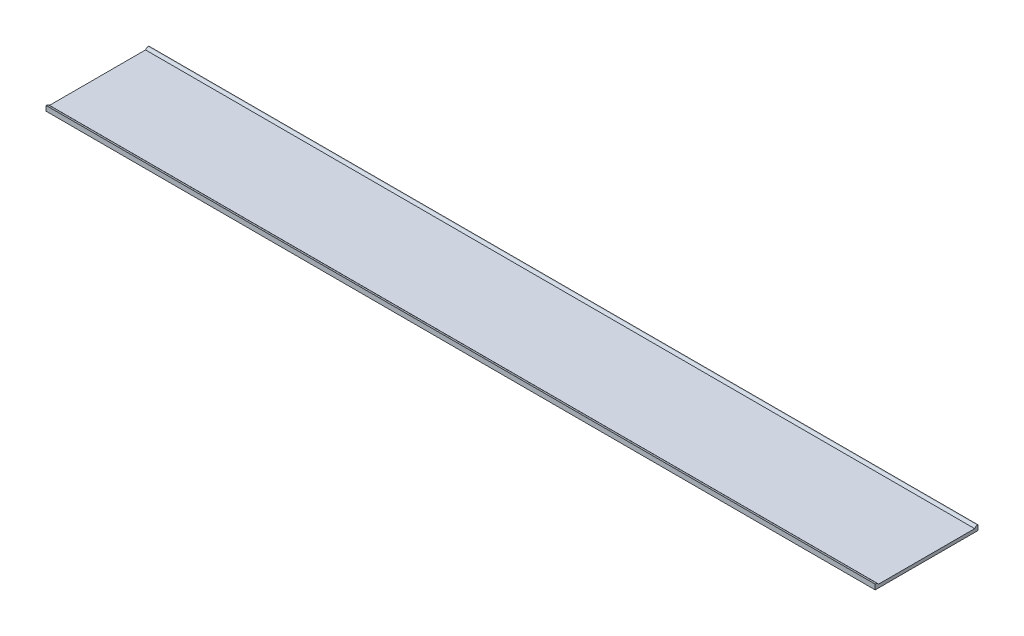
ISO-10303-21;
HEADER;
FILE_DESCRIPTION(('STEP AP214'),'2;1');
FILE_NAME('part.step','',(''),(''),'','','');
FILE_SCHEMA(('AUTOMOTIVE_DESIGN { 1 0 10303 214 1 1 1 1 }'));
ENDSEC;
DATA;
#1=APPLICATION_CONTEXT('core data for automotive mechanical design processes');
#2=APPLICATION_PROTOCOL_DEFINITION('international standard','automotive_design',2000,#1);
#3=PRODUCT_CONTEXT('',#1,'mechanical');
#4=PRODUCT('Part','Part','',(#3));
#5=PRODUCT_RELATED_PRODUCT_CATEGORY('part','',(#4));
#6=PRODUCT_DEFINITION_FORMATION('','',#4);
#7=PRODUCT_DEFINITION_CONTEXT('part definition',#1,'design');
#8=PRODUCT_DEFINITION('design','',#6,#7);
#9=PRODUCT_DEFINITION_SHAPE('','',#8);
#10=(LENGTH_UNIT() NAMED_UNIT(*) SI_UNIT(.MILLI.,.METRE.));
#11=(NAMED_UNIT(*) PLANE_ANGLE_UNIT() SI_UNIT($,.RADIAN.));
#12=(NAMED_UNIT(*) SI_UNIT($,.STERADIAN.) SOLID_ANGLE_UNIT());
#13=UNCERTAINTY_MEASURE_WITH_UNIT(LENGTH_MEASURE(1.E-05),#10,'distance_accuracy_value','');
#14=(GEOMETRIC_REPRESENTATION_CONTEXT(3) GLOBAL_UNCERTAINTY_ASSIGNED_CONTEXT((#13)) GLOBAL_UNIT_ASSIGNED_CONTEXT((#10,
#11,#12)) REPRESENTATION_CONTEXT('',''));
#15=CARTESIAN_POINT('',(0.,0.,0.));
#16=DIRECTION('',(0.,0.,1.));
#17=DIRECTION('',(1.,0.,0.));
#18=AXIS2_PLACEMENT_3D('',#15,#16,#17);
#19=CARTESIAN_POINT('',(250.,2.,29.));
#20=DIRECTION('',(-1.,0.,0.));
#21=DIRECTION('',(0.,0.,1.));
#22=AXIS2_PLACEMENT_3D('',#19,#20,#21);
#23=PLANE('',#22);
#24=DIRECTION('',(0.,0.,-1.));
#25=VECTOR('',#24,1.);
#26=CARTESIAN_POINT('',(250.,3.,-31.));
#27=LINE('',#26,#25);
#28=CARTESIAN_POINT('',(250.,3.,-30.7320508075689));
#29=VERTEX_POINT('',#28);
#30=CARTESIAN_POINT('',(250.,3.,-31.));
#31=VERTEX_POINT('',#30);
#32=EDGE_CURVE('E113',#29,#31,#27,.T.);
#33=ORIENTED_EDGE('',*,*,#32,.F.);
#34=CARTESIAN_POINT('',(250.,1.,-30.7320508075689));
#35=DIRECTION('',(-1.,0.,0.));
#36=DIRECTION('',(0.,0.,1.));
#37=AXIS2_PLACEMENT_3D('',#34,#35,#36);
#38=CIRCLE('',#37,2.);
#39=CARTESIAN_POINT('',(250.,2.,-29.));
#40=VERTEX_POINT('',#39);
#41=EDGE_CURVE('E188',#29,#40,#38,.F.);
#42=ORIENTED_EDGE('',*,*,#41,.T.);
#43=DIRECTION('',(0.,0.,-1.));
#44=VECTOR('',#43,1.);
#45=CARTESIAN_POINT('',(250.,2.,29.));
#46=LINE('',#45,#44);
#47=CARTESIAN_POINT('',(250.,2.,29.));
#48=VERTEX_POINT('',#47);
#49=EDGE_CURVE('E168',#48,#40,#46,.T.);
#50=ORIENTED_EDGE('',*,*,#49,.F.);
#51=CARTESIAN_POINT('',(250.,1.,30.7320508075689));
#52=DIRECTION('',(-1.,0.,0.));
#53=DIRECTION('',(0.,0.,1.));
#54=AXIS2_PLACEMENT_3D('',#51,#52,#53);
#55=CIRCLE('',#54,2.);
#56=CARTESIAN_POINT('',(250.,3.,30.7320508075689));
#57=VERTEX_POINT('',#56);
#58=EDGE_CURVE('E68',#48,#57,#55,.F.);
#59=ORIENTED_EDGE('',*,*,#58,.T.);
#60=DIRECTION('',(0.,0.,-1.));
#61=VECTOR('',#60,1.);
#62=CARTESIAN_POINT('',(250.,3.,31.));
#63=LINE('',#62,#61);
#64=CARTESIAN_POINT('',(250.,3.,31.));
#65=VERTEX_POINT('',#64);
#66=EDGE_CURVE('E155',#65,#57,#63,.T.);
#67=ORIENTED_EDGE('',*,*,#66,.F.);
#68=DIRECTION('',(0.,-1.,0.));
#69=VECTOR('',#68,1.);
#70=CARTESIAN_POINT('',(250.,3.,31.));
#71=LINE('',#70,#69);
#72=CARTESIAN_POINT('',(250.,0.,31.));
#73=VERTEX_POINT('',#72);
#74=EDGE_CURVE('E152',#65,#73,#71,.T.);
#75=ORIENTED_EDGE('',*,*,#74,.T.);
#76=DIRECTION('',(0.,0.,-1.));
#77=VECTOR('',#76,1.);
#78=CARTESIAN_POINT('',(250.,0.,29.));
#79=LINE('',#78,#77);
#80=CARTESIAN_POINT('',(250.,0.,-31.));
#81=VERTEX_POINT('',#80);
#82=EDGE_CURVE('E137',#73,#81,#79,.T.);
#83=ORIENTED_EDGE('',*,*,#82,.T.);
#84=DIRECTION('',(0.,-1.,0.));
#85=VECTOR('',#84,1.);
#86=CARTESIAN_POINT('',(250.,3.,-31.));
#87=LINE('',#86,#85);
#88=EDGE_CURVE('E129',#31,#81,#87,.T.);
#89=ORIENTED_EDGE('',*,*,#88,.F.);
#90=EDGE_LOOP('',(#33,#42,#50,#59,#67,#75,#83,#89));
#91=FACE_BOUND('',#90,.T.);
#92=ADVANCED_FACE('F45',(#91),#23,.F.);
#93=CARTESIAN_POINT('',(-250.,2.,29.));
#94=DIRECTION('',(1.,0.,0.));
#95=DIRECTION('',(0.,0.,-1.));
#96=AXIS2_PLACEMENT_3D('',#93,#94,#95);
#97=PLANE('',#96);
#98=DIRECTION('',(0.,0.,1.));
#99=VECTOR('',#98,1.);
#100=CARTESIAN_POINT('',(-250.,2.,29.));
#101=LINE('',#100,#99);
#102=CARTESIAN_POINT('',(-250.,2.,-29.));
#103=VERTEX_POINT('',#102);
#104=CARTESIAN_POINT('',(-250.,2.,29.));
#105=VERTEX_POINT('',#104);
#106=EDGE_CURVE('E175',#103,#105,#101,.T.);
#107=ORIENTED_EDGE('',*,*,#106,.F.);
#108=CARTESIAN_POINT('',(-250.,1.,-30.7320508075689));
#109=DIRECTION('',(1.,0.,0.));
#110=DIRECTION('',(0.,0.,-1.));
#111=AXIS2_PLACEMENT_3D('',#108,#109,#110);
#112=CIRCLE('',#111,2.);
#113=CARTESIAN_POINT('',(-250.,3.,-30.7320508075689));
#114=VERTEX_POINT('',#113);
#115=EDGE_CURVE('E54',#103,#114,#112,.F.);
#116=ORIENTED_EDGE('',*,*,#115,.T.);
#117=DIRECTION('',(0.,0.,1.));
#118=VECTOR('',#117,1.);
#119=CARTESIAN_POINT('',(-250.,3.,-31.));
#120=LINE('',#119,#118);
#121=CARTESIAN_POINT('',(-250.,3.,-31.));
#122=VERTEX_POINT('',#121);
#123=EDGE_CURVE('E134',#122,#114,#120,.T.);
#124=ORIENTED_EDGE('',*,*,#123,.F.);
#125=DIRECTION('',(0.,-1.,0.));
#126=VECTOR('',#125,1.);
#127=CARTESIAN_POINT('',(-250.,3.,-31.));
#128=LINE('',#127,#126);
#129=CARTESIAN_POINT('',(-250.,0.,-31.));
#130=VERTEX_POINT('',#129);
#131=EDGE_CURVE('E131',#122,#130,#128,.T.);
#132=ORIENTED_EDGE('',*,*,#131,.T.);
#133=DIRECTION('',(0.,0.,1.));
#134=VECTOR('',#133,1.);
#135=CARTESIAN_POINT('',(-250.,0.,29.));
#136=LINE('',#135,#134);
#137=CARTESIAN_POINT('',(-250.,0.,31.));
#138=VERTEX_POINT('',#137);
#139=EDGE_CURVE('E143',#130,#138,#136,.T.);
#140=ORIENTED_EDGE('',*,*,#139,.T.);
#141=DIRECTION('',(0.,-1.,0.));
#142=VECTOR('',#141,1.);
#143=CARTESIAN_POINT('',(-250.,3.,31.));
#144=LINE('',#143,#142);
#145=CARTESIAN_POINT('',(-250.,3.,31.));
#146=VERTEX_POINT('',#145);
#147=EDGE_CURVE('E148',#146,#138,#144,.T.);
#148=ORIENTED_EDGE('',*,*,#147,.F.);
#149=DIRECTION('',(0.,0.,1.));
#150=VECTOR('',#149,1.);
#151=CARTESIAN_POINT('',(-250.,3.,31.));
#152=LINE('',#151,#150);
#153=CARTESIAN_POINT('',(-250.,3.,30.7320508075689));
#154=VERTEX_POINT('',#153);
#155=EDGE_CURVE('E160',#154,#146,#152,.T.);
#156=ORIENTED_EDGE('',*,*,#155,.F.);
#157=CARTESIAN_POINT('',(-250.,1.,30.7320508075689));
#158=DIRECTION('',(1.,0.,0.));
#159=DIRECTION('',(0.,0.,-1.));
#160=AXIS2_PLACEMENT_3D('',#157,#158,#159);
#161=CIRCLE('',#160,2.);
#162=EDGE_CURVE('E61',#154,#105,#161,.F.);
#163=ORIENTED_EDGE('',*,*,#162,.T.);
#164=EDGE_LOOP('',(#107,#116,#124,#132,#140,#148,#156,#163));
#165=FACE_BOUND('',#164,.T.);
#166=ADVANCED_FACE('F196',(#165),#97,.F.);
#167=CARTESIAN_POINT('',(0.,2.,0.));
#168=DIRECTION('',(0.,-1.,0.));
#169=DIRECTION('',(0.,0.,-1.));
#170=AXIS2_PLACEMENT_3D('',#167,#168,#169);
#171=PLANE('',#170);
#172=ORIENTED_EDGE('',*,*,#49,.T.);
#173=DIRECTION('',(-1.,0.,0.));
#174=VECTOR('',#173,1.);
#175=CARTESIAN_POINT('',(-250.,2.,-29.));
#176=LINE('',#175,#174);
#177=EDGE_CURVE('E172',#40,#103,#176,.T.);
#178=ORIENTED_EDGE('',*,*,#177,.T.);
#179=ORIENTED_EDGE('',*,*,#106,.T.);
#180=DIRECTION('',(1.,0.,0.));
#181=VECTOR('',#180,1.);
#182=CARTESIAN_POINT('',(-250.,2.,29.));
#183=LINE('',#182,#181);
#184=EDGE_CURVE('E179',#105,#48,#183,.T.);
#185=ORIENTED_EDGE('',*,*,#184,.T.);
#186=EDGE_LOOP('',(#172,#178,#179,#185));
#187=FACE_BOUND('',#186,.T.);
#188=ADVANCED_FACE('F203',(#187),#171,.F.);
#189=CARTESIAN_POINT('',(0.,0.,0.));
#190=DIRECTION('',(0.,-1.,0.));
#191=DIRECTION('',(0.,0.,-1.));
#192=AXIS2_PLACEMENT_3D('',#189,#190,#191);
#193=PLANE('',#192);
#194=ORIENTED_EDGE('',*,*,#82,.F.);
#195=DIRECTION('',(1.,0.,0.));
#196=VECTOR('',#195,1.);
#197=CARTESIAN_POINT('',(-250.,0.,31.));
#198=LINE('',#197,#196);
#199=EDGE_CURVE('E156',#138,#73,#198,.T.);
#200=ORIENTED_EDGE('',*,*,#199,.F.);
#201=ORIENTED_EDGE('',*,*,#139,.F.);
#202=DIRECTION('',(-1.,0.,0.));
#203=VECTOR('',#202,1.);
#204=CARTESIAN_POINT('',(-250.,0.,-31.));
#205=LINE('',#204,#203);
#206=EDGE_CURVE('E123',#81,#130,#205,.T.);
#207=ORIENTED_EDGE('',*,*,#206,.F.);
#208=EDGE_LOOP('',(#194,#200,#201,#207));
#209=FACE_BOUND('',#208,.T.);
#210=ADVANCED_FACE('F214',(#209),#193,.T.);
#211=CARTESIAN_POINT('',(-250.,3.,31.));
#212=DIRECTION('',(0.,0.,-1.));
#213=DIRECTION('',(-1.,0.,0.));
#214=AXIS2_PLACEMENT_3D('',#211,#212,#213);
#215=PLANE('',#214);
#216=ORIENTED_EDGE('',*,*,#199,.T.);
#217=ORIENTED_EDGE('',*,*,#74,.F.);
#218=DIRECTION('',(1.,0.,0.));
#219=VECTOR('',#218,1.);
#220=CARTESIAN_POINT('',(-250.,3.,31.));
#221=LINE('',#220,#219);
#222=EDGE_CURVE('E163',#146,#65,#221,.T.);
#223=ORIENTED_EDGE('',*,*,#222,.F.);
#224=ORIENTED_EDGE('',*,*,#147,.T.);
#225=EDGE_LOOP('',(#216,#217,#223,#224));
#226=FACE_BOUND('',#225,.T.);
#227=ADVANCED_FACE('F211',(#226),#215,.F.);
#228=CARTESIAN_POINT('',(0.,3.,0.));
#229=DIRECTION('',(0.,-1.,0.));
#230=DIRECTION('',(0.,0.,-1.));
#231=AXIS2_PLACEMENT_3D('',#228,#229,#230);
#232=PLANE('',#231);
#233=ORIENTED_EDGE('',*,*,#66,.T.);
#234=DIRECTION('',(1.,0.,0.));
#235=VECTOR('',#234,1.);
#236=CARTESIAN_POINT('',(0.,3.,30.7320508075689));
#237=LINE('',#236,#235);
#238=EDGE_CURVE('E11',#57,#154,#237,.F.);
#239=ORIENTED_EDGE('',*,*,#238,.T.);
#240=ORIENTED_EDGE('',*,*,#155,.T.);
#241=ORIENTED_EDGE('',*,*,#222,.T.);
#242=EDGE_LOOP('',(#233,#239,#240,#241));
#243=FACE_BOUND('',#242,.T.);
#244=ADVANCED_FACE('F206',(#243),#232,.F.);
#245=CARTESIAN_POINT('',(-250.,3.,-31.));
#246=DIRECTION('',(0.,0.,1.));
#247=DIRECTION('',(1.,0.,0.));
#248=AXIS2_PLACEMENT_3D('',#245,#246,#247);
#249=PLANE('',#248);
#250=ORIENTED_EDGE('',*,*,#206,.T.);
#251=ORIENTED_EDGE('',*,*,#131,.F.);
#252=DIRECTION('',(-1.,0.,0.));
#253=VECTOR('',#252,1.);
#254=CARTESIAN_POINT('',(-250.,3.,-31.));
#255=LINE('',#254,#253);
#256=EDGE_CURVE('E117',#31,#122,#255,.T.);
#257=ORIENTED_EDGE('',*,*,#256,.F.);
#258=ORIENTED_EDGE('',*,*,#88,.T.);
#259=EDGE_LOOP('',(#250,#251,#257,#258));
#260=FACE_BOUND('',#259,.T.);
#261=ADVANCED_FACE('F128',(#260),#249,.F.);
#262=CARTESIAN_POINT('',(0.,3.,0.));
#263=DIRECTION('',(0.,1.,0.));
#264=DIRECTION('',(0.,0.,1.));
#265=AXIS2_PLACEMENT_3D('',#262,#263,#264);
#266=PLANE('',#265);
#267=ORIENTED_EDGE('',*,*,#123,.T.);
#268=DIRECTION('',(1.,0.,0.));
#269=VECTOR('',#268,1.);
#270=CARTESIAN_POINT('',(250.,3.,-30.7320508075689));
#271=LINE('',#270,#269);
#272=EDGE_CURVE('E120',#114,#29,#271,.T.);
#273=ORIENTED_EDGE('',*,*,#272,.T.);
#274=ORIENTED_EDGE('',*,*,#32,.T.);
#275=ORIENTED_EDGE('',*,*,#256,.T.);
#276=EDGE_LOOP('',(#267,#273,#274,#275));
#277=FACE_BOUND('',#276,.T.);
#278=ADVANCED_FACE('F116',(#277),#266,.T.);
#279=CARTESIAN_POINT('',(-250.,1.,-30.7320508075689));
#280=DIRECTION('',(-1.,0.,0.));
#281=DIRECTION('',(0.,0.,1.));
#282=AXIS2_PLACEMENT_3D('',#279,#280,#281);
#283=CYLINDRICAL_SURFACE('',#282,2.);
#284=ORIENTED_EDGE('',*,*,#115,.F.);
#285=ORIENTED_EDGE('',*,*,#177,.F.);
#286=ORIENTED_EDGE('',*,*,#41,.F.);
#287=ORIENTED_EDGE('',*,*,#272,.F.);
#288=EDGE_LOOP('',(#284,#285,#286,#287));
#289=FACE_BOUND('',#288,.T.);
#290=ADVANCED_FACE('F201',(#289),#283,.T.);
#291=CARTESIAN_POINT('',(-250.,1.,30.7320508075689));
#292=DIRECTION('',(1.,0.,0.));
#293=DIRECTION('',(0.,0.,-1.));
#294=AXIS2_PLACEMENT_3D('',#291,#292,#293);
#295=CYLINDRICAL_SURFACE('',#294,2.);
#296=ORIENTED_EDGE('',*,*,#58,.F.);
#297=ORIENTED_EDGE('',*,*,#184,.F.);
#298=ORIENTED_EDGE('',*,*,#162,.F.);
#299=ORIENTED_EDGE('',*,*,#238,.F.);
#300=EDGE_LOOP('',(#296,#297,#298,#299));
#301=FACE_BOUND('',#300,.T.);
#302=ADVANCED_FACE('F47',(#301),#295,.T.);
#303=CLOSED_SHELL('',(#92,#166,#188,#210,#227,#244,#261,#278,#290,#302));
#304=MANIFOLD_SOLID_BREP('B2',#303);
#305=ADVANCED_BREP_SHAPE_REPRESENTATION('',(#18,#304),#14);
#306=SHAPE_DEFINITION_REPRESENTATION(#9,#305);
ENDSEC;
END-ISO-10303-21;
